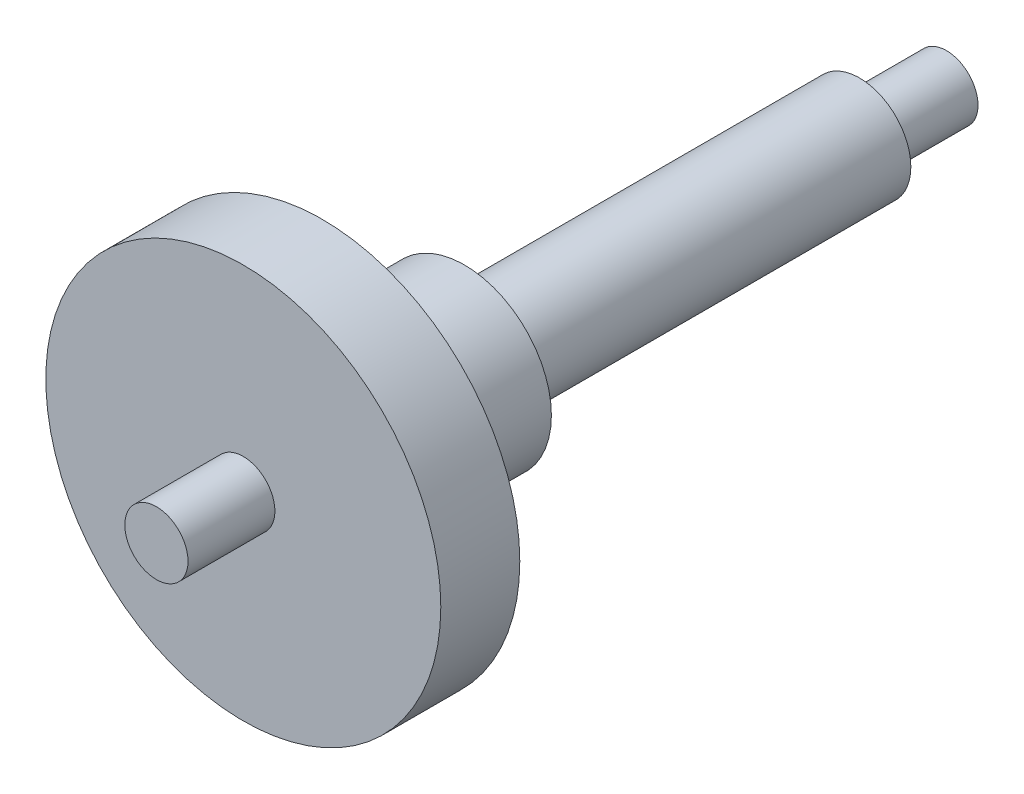
ISO-10303-21;
HEADER;
FILE_DESCRIPTION(('STEP AP214'),'2;1');
FILE_NAME('part.step','',(''),(''),'','','');
FILE_SCHEMA(('AUTOMOTIVE_DESIGN { 1 0 10303 214 1 1 1 1 }'));
ENDSEC;
DATA;
#1=APPLICATION_CONTEXT('core data for automotive mechanical design processes');
#2=APPLICATION_PROTOCOL_DEFINITION('international standard','automotive_design',2000,#1);
#3=PRODUCT_CONTEXT('',#1,'mechanical');
#4=PRODUCT('Part','Part','',(#3));
#5=PRODUCT_RELATED_PRODUCT_CATEGORY('part','',(#4));
#6=PRODUCT_DEFINITION_FORMATION('','',#4);
#7=PRODUCT_DEFINITION_CONTEXT('part definition',#1,'design');
#8=PRODUCT_DEFINITION('design','',#6,#7);
#9=PRODUCT_DEFINITION_SHAPE('','',#8);
#10=(LENGTH_UNIT() NAMED_UNIT(*) SI_UNIT(.MILLI.,.METRE.));
#11=(NAMED_UNIT(*) PLANE_ANGLE_UNIT() SI_UNIT($,.RADIAN.));
#12=(NAMED_UNIT(*) SI_UNIT($,.STERADIAN.) SOLID_ANGLE_UNIT());
#13=UNCERTAINTY_MEASURE_WITH_UNIT(LENGTH_MEASURE(1.E-05),#10,'distance_accuracy_value','');
#14=(GEOMETRIC_REPRESENTATION_CONTEXT(3) GLOBAL_UNCERTAINTY_ASSIGNED_CONTEXT((#13)) GLOBAL_UNIT_ASSIGNED_CONTEXT((#10,
#11,#12)) REPRESENTATION_CONTEXT('',''));
#15=CARTESIAN_POINT('',(0.,0.,0.));
#16=DIRECTION('',(0.,0.,1.));
#17=DIRECTION('',(1.,0.,0.));
#18=AXIS2_PLACEMENT_3D('',#15,#16,#17);
#19=CARTESIAN_POINT('',(0.,0.,1.1));
#20=DIRECTION('',(0.,0.,-1.));
#21=DIRECTION('',(-1.,0.,0.));
#22=AXIS2_PLACEMENT_3D('',#19,#20,#21);
#23=CYLINDRICAL_SURFACE('',#22,0.4);
#24=CARTESIAN_POINT('',(0.,0.,1.1));
#25=DIRECTION('',(0.,0.,1.));
#26=DIRECTION('',(1.,0.,0.));
#27=AXIS2_PLACEMENT_3D('',#24,#25,#26);
#28=CIRCLE('',#27,0.4);
#29=CARTESIAN_POINT('',(0.4,0.,1.1));
#30=VERTEX_POINT('',#29);
#31=EDGE_CURVE('E45',#30,#30,#28,.T.);
#32=ORIENTED_EDGE('',*,*,#31,.F.);
#33=EDGE_LOOP('',(#32));
#34=FACE_BOUND('',#33,.T.);
#35=CARTESIAN_POINT('',(0.,0.,0.));
#36=DIRECTION('',(0.,0.,1.));
#37=DIRECTION('',(1.,0.,0.));
#38=AXIS2_PLACEMENT_3D('',#35,#36,#37);
#39=CIRCLE('',#38,0.4);
#40=CARTESIAN_POINT('',(0.4,0.,0.));
#41=VERTEX_POINT('',#40);
#42=EDGE_CURVE('E40',#41,#41,#39,.T.);
#43=ORIENTED_EDGE('',*,*,#42,.T.);
#44=EDGE_LOOP('',(#43));
#45=FACE_BOUND('',#44,.T.);
#46=ADVANCED_FACE('F37',(#34,#45),#23,.T.);
#47=CARTESIAN_POINT('',(0.,0.,0.));
#48=DIRECTION('',(0.,0.,1.));
#49=DIRECTION('',(1.,0.,0.));
#50=AXIS2_PLACEMENT_3D('',#47,#48,#49);
#51=PLANE('',#50);
#52=ORIENTED_EDGE('',*,*,#42,.F.);
#53=EDGE_LOOP('',(#52));
#54=FACE_BOUND('',#53,.T.);
#55=ADVANCED_FACE('F93',(#54),#51,.F.);
#56=CARTESIAN_POINT('',(0.,0.,6.1));
#57=DIRECTION('',(0.,0.,-1.));
#58=DIRECTION('',(-1.,0.,0.));
#59=AXIS2_PLACEMENT_3D('',#56,#57,#58);
#60=CYLINDRICAL_SURFACE('',#59,0.65);
#61=CARTESIAN_POINT('',(0.,0.,6.1));
#62=DIRECTION('',(0.,0.,1.));
#63=DIRECTION('',(1.,0.,0.));
#64=AXIS2_PLACEMENT_3D('',#61,#62,#63);
#65=CIRCLE('',#64,0.65);
#66=CARTESIAN_POINT('',(0.65,0.,6.1));
#67=VERTEX_POINT('',#66);
#68=EDGE_CURVE('E71',#67,#67,#65,.T.);
#69=ORIENTED_EDGE('',*,*,#68,.F.);
#70=EDGE_LOOP('',(#69));
#71=FACE_BOUND('',#70,.T.);
#72=CARTESIAN_POINT('',(0.,0.,1.1));
#73=DIRECTION('',(0.,0.,1.));
#74=DIRECTION('',(1.,0.,0.));
#75=AXIS2_PLACEMENT_3D('',#72,#73,#74);
#76=CIRCLE('',#75,0.65);
#77=CARTESIAN_POINT('',(0.65,0.,1.1));
#78=VERTEX_POINT('',#77);
#79=EDGE_CURVE('E67',#78,#78,#76,.T.);
#80=ORIENTED_EDGE('',*,*,#79,.T.);
#81=EDGE_LOOP('',(#80));
#82=FACE_BOUND('',#81,.T.);
#83=ADVANCED_FACE('F79',(#71,#82),#60,.T.);
#84=CARTESIAN_POINT('',(0.,0.,1.1));
#85=DIRECTION('',(0.,0.,1.));
#86=DIRECTION('',(1.,0.,0.));
#87=AXIS2_PLACEMENT_3D('',#84,#85,#86);
#88=PLANE('',#87);
#89=ORIENTED_EDGE('',*,*,#31,.T.);
#90=EDGE_LOOP('',(#89));
#91=FACE_BOUND('',#90,.T.);
#92=ORIENTED_EDGE('',*,*,#79,.F.);
#93=EDGE_LOOP('',(#92));
#94=FACE_BOUND('',#93,.T.);
#95=ADVANCED_FACE('F81',(#91,#94),#88,.F.);
#96=CARTESIAN_POINT('',(0.,0.,7.9));
#97=DIRECTION('',(0.,0.,-1.));
#98=DIRECTION('',(-1.,0.,0.));
#99=AXIS2_PLACEMENT_3D('',#96,#97,#98);
#100=CYLINDRICAL_SURFACE('',#99,1.1);
#101=CARTESIAN_POINT('',(0.,0.,7.9));
#102=DIRECTION('',(0.,0.,1.));
#103=DIRECTION('',(1.,0.,0.));
#104=AXIS2_PLACEMENT_3D('',#101,#102,#103);
#105=CIRCLE('',#104,1.1);
#106=CARTESIAN_POINT('',(1.1,0.,7.9));
#107=VERTEX_POINT('',#106);
#108=EDGE_CURVE('E63',#107,#107,#105,.T.);
#109=ORIENTED_EDGE('',*,*,#108,.F.);
#110=EDGE_LOOP('',(#109));
#111=FACE_BOUND('',#110,.T.);
#112=CARTESIAN_POINT('',(0.,0.,6.1));
#113=DIRECTION('',(0.,0.,1.));
#114=DIRECTION('',(1.,0.,0.));
#115=AXIS2_PLACEMENT_3D('',#112,#113,#114);
#116=CIRCLE('',#115,1.1);
#117=CARTESIAN_POINT('',(1.1,0.,6.1));
#118=VERTEX_POINT('',#117);
#119=EDGE_CURVE('E58',#118,#118,#116,.T.);
#120=ORIENTED_EDGE('',*,*,#119,.T.);
#121=EDGE_LOOP('',(#120));
#122=FACE_BOUND('',#121,.T.);
#123=ADVANCED_FACE('F83',(#111,#122),#100,.T.);
#124=CARTESIAN_POINT('',(0.,0.,6.1));
#125=DIRECTION('',(0.,0.,1.));
#126=DIRECTION('',(1.,0.,0.));
#127=AXIS2_PLACEMENT_3D('',#124,#125,#126);
#128=PLANE('',#127);
#129=ORIENTED_EDGE('',*,*,#68,.T.);
#130=EDGE_LOOP('',(#129));
#131=FACE_BOUND('',#130,.T.);
#132=ORIENTED_EDGE('',*,*,#119,.F.);
#133=EDGE_LOOP('',(#132));
#134=FACE_BOUND('',#133,.T.);
#135=ADVANCED_FACE('F90',(#131,#134),#128,.F.);
#136=CARTESIAN_POINT('',(0.,0.,8.9));
#137=DIRECTION('',(0.,0.,-1.));
#138=DIRECTION('',(-1.,0.,0.));
#139=AXIS2_PLACEMENT_3D('',#136,#137,#138);
#140=CYLINDRICAL_SURFACE('',#139,2.5);
#141=CARTESIAN_POINT('',(0.,0.,8.9));
#142=DIRECTION('',(0.,0.,1.));
#143=DIRECTION('',(1.,0.,0.));
#144=AXIS2_PLACEMENT_3D('',#141,#142,#143);
#145=CIRCLE('',#144,2.5);
#146=CARTESIAN_POINT('',(2.5,0.,8.9));
#147=VERTEX_POINT('',#146);
#148=EDGE_CURVE('E54',#147,#147,#145,.T.);
#149=ORIENTED_EDGE('',*,*,#148,.F.);
#150=EDGE_LOOP('',(#149));
#151=FACE_BOUND('',#150,.T.);
#152=CARTESIAN_POINT('',(0.,0.,7.9));
#153=DIRECTION('',(0.,0.,1.));
#154=DIRECTION('',(1.,0.,0.));
#155=AXIS2_PLACEMENT_3D('',#152,#153,#154);
#156=CIRCLE('',#155,2.5);
#157=CARTESIAN_POINT('',(2.5,0.,7.9));
#158=VERTEX_POINT('',#157);
#159=EDGE_CURVE('E59',#158,#158,#156,.T.);
#160=ORIENTED_EDGE('',*,*,#159,.T.);
#161=EDGE_LOOP('',(#160));
#162=FACE_BOUND('',#161,.T.);
#163=ADVANCED_FACE('F132',(#151,#162),#140,.T.);
#164=CARTESIAN_POINT('',(0.,0.,8.9));
#165=DIRECTION('',(0.,0.,1.));
#166=DIRECTION('',(1.,0.,0.));
#167=AXIS2_PLACEMENT_3D('',#164,#165,#166);
#168=PLANE('',#167);
#169=CARTESIAN_POINT('',(0.,0.,8.9));
#170=DIRECTION('',(0.,0.,1.));
#171=DIRECTION('',(1.,0.,0.));
#172=AXIS2_PLACEMENT_3D('',#169,#170,#171);
#173=CIRCLE('',#172,0.4);
#174=CARTESIAN_POINT('',(0.4,0.,8.9));
#175=VERTEX_POINT('',#174);
#176=EDGE_CURVE('E10',#175,#175,#173,.T.);
#177=ORIENTED_EDGE('',*,*,#176,.F.);
#178=EDGE_LOOP('',(#177));
#179=FACE_BOUND('',#178,.T.);
#180=ORIENTED_EDGE('',*,*,#148,.T.);
#181=EDGE_LOOP('',(#180));
#182=FACE_BOUND('',#181,.T.);
#183=ADVANCED_FACE('F142',(#179,#182),#168,.T.);
#184=CARTESIAN_POINT('',(0.,0.,7.9));
#185=DIRECTION('',(0.,0.,1.));
#186=DIRECTION('',(1.,0.,0.));
#187=AXIS2_PLACEMENT_3D('',#184,#185,#186);
#188=PLANE('',#187);
#189=ORIENTED_EDGE('',*,*,#108,.T.);
#190=EDGE_LOOP('',(#189));
#191=FACE_BOUND('',#190,.T.);
#192=ORIENTED_EDGE('',*,*,#159,.F.);
#193=EDGE_LOOP('',(#192));
#194=FACE_BOUND('',#193,.T.);
#195=ADVANCED_FACE('F150',(#191,#194),#188,.F.);
#196=CARTESIAN_POINT('',(0.,0.,10.));
#197=DIRECTION('',(0.,0.,-1.));
#198=DIRECTION('',(-1.,0.,0.));
#199=AXIS2_PLACEMENT_3D('',#196,#197,#198);
#200=CYLINDRICAL_SURFACE('',#199,0.4);
#201=CARTESIAN_POINT('',(0.,0.,10.));
#202=DIRECTION('',(0.,0.,1.));
#203=DIRECTION('',(1.,0.,0.));
#204=AXIS2_PLACEMENT_3D('',#201,#202,#203);
#205=CIRCLE('',#204,0.4);
#206=CARTESIAN_POINT('',(0.4,0.,10.));
#207=VERTEX_POINT('',#206);
#208=EDGE_CURVE('E53',#207,#207,#205,.T.);
#209=ORIENTED_EDGE('',*,*,#208,.F.);
#210=EDGE_LOOP('',(#209));
#211=FACE_BOUND('',#210,.T.);
#212=ORIENTED_EDGE('',*,*,#176,.T.);
#213=EDGE_LOOP('',(#212));
#214=FACE_BOUND('',#213,.T.);
#215=ADVANCED_FACE('F155',(#211,#214),#200,.T.);
#216=CARTESIAN_POINT('',(0.,0.,10.));
#217=DIRECTION('',(0.,0.,1.));
#218=DIRECTION('',(1.,0.,0.));
#219=AXIS2_PLACEMENT_3D('',#216,#217,#218);
#220=PLANE('',#219);
#221=ORIENTED_EDGE('',*,*,#208,.T.);
#222=EDGE_LOOP('',(#221));
#223=FACE_BOUND('',#222,.T.);
#224=ADVANCED_FACE('F172',(#223),#220,.T.);
#225=CLOSED_SHELL('',(#46,#55,#83,#95,#123,#135,#163,#183,#195,#215,#224));
#226=MANIFOLD_SOLID_BREP('B2',#225);
#227=ADVANCED_BREP_SHAPE_REPRESENTATION('',(#18,#226),#14);
#228=SHAPE_DEFINITION_REPRESENTATION(#9,#227);
ENDSEC;
END-ISO-10303-21;
